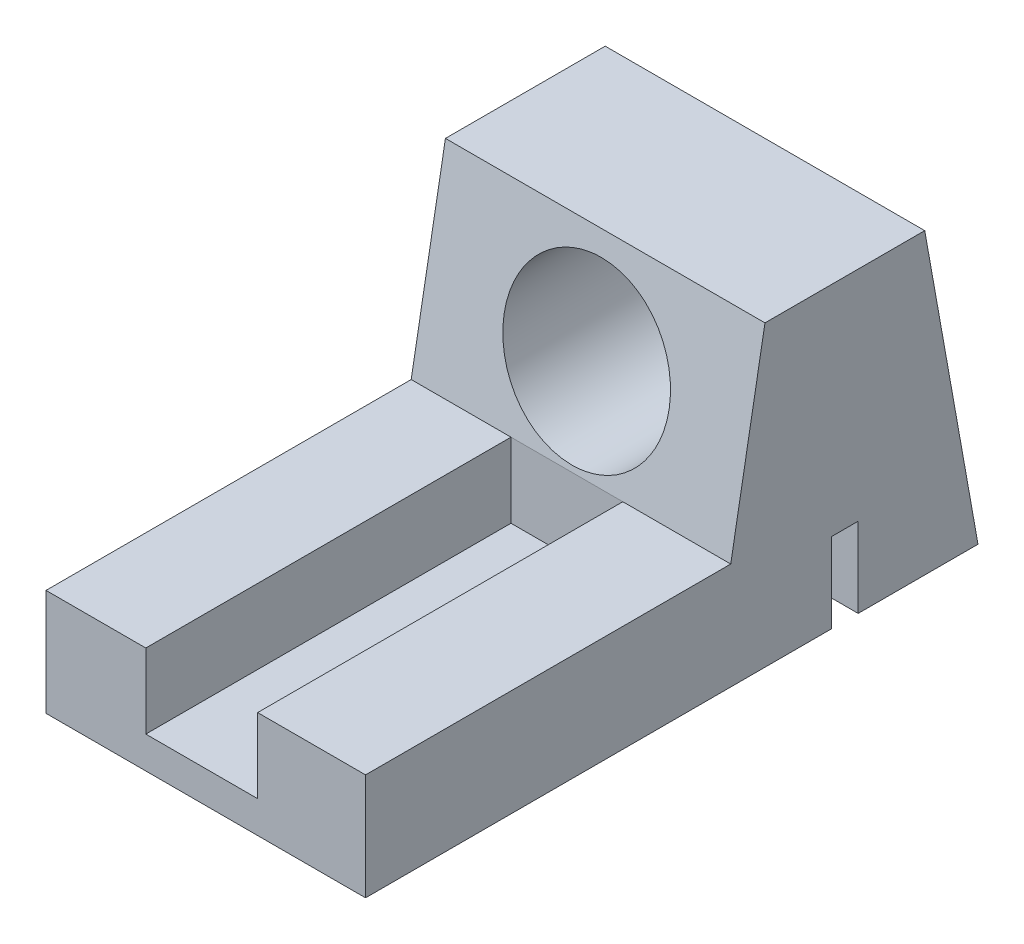
ISO-10303-21;
HEADER;
FILE_DESCRIPTION(('STEP AP214'),'2;1');
FILE_NAME('part.step','',(''),(''),'','','');
FILE_SCHEMA(('AUTOMOTIVE_DESIGN { 1 0 10303 214 1 1 1 1 }'));
ENDSEC;
DATA;
#1=APPLICATION_CONTEXT('core data for automotive mechanical design processes');
#2=APPLICATION_PROTOCOL_DEFINITION('international standard','automotive_design',2000,#1);
#3=PRODUCT_CONTEXT('',#1,'mechanical');
#4=PRODUCT('Part','Part','',(#3));
#5=PRODUCT_RELATED_PRODUCT_CATEGORY('part','',(#4));
#6=PRODUCT_DEFINITION_FORMATION('','',#4);
#7=PRODUCT_DEFINITION_CONTEXT('part definition',#1,'design');
#8=PRODUCT_DEFINITION('design','',#6,#7);
#9=PRODUCT_DEFINITION_SHAPE('','',#8);
#10=(LENGTH_UNIT() NAMED_UNIT(*) SI_UNIT(.MILLI.,.METRE.));
#11=(NAMED_UNIT(*) PLANE_ANGLE_UNIT() SI_UNIT($,.RADIAN.));
#12=(NAMED_UNIT(*) SI_UNIT($,.STERADIAN.) SOLID_ANGLE_UNIT());
#13=UNCERTAINTY_MEASURE_WITH_UNIT(LENGTH_MEASURE(1.E-05),#10,'distance_accuracy_value','');
#14=(GEOMETRIC_REPRESENTATION_CONTEXT(3) GLOBAL_UNCERTAINTY_ASSIGNED_CONTEXT((#13)) GLOBAL_UNIT_ASSIGNED_CONTEXT((#10,
#11,#12)) REPRESENTATION_CONTEXT('',''));
#15=CARTESIAN_POINT('',(0.,0.,0.));
#16=DIRECTION('',(0.,0.,1.));
#17=DIRECTION('',(1.,0.,0.));
#18=AXIS2_PLACEMENT_3D('',#15,#16,#17);
#19=CARTESIAN_POINT('',(0.,-31.454396412768,0.));
#20=DIRECTION('',(0.,-1.,0.));
#21=DIRECTION('',(0.,0.,-1.));
#22=AXIS2_PLACEMENT_3D('',#19,#20,#21);
#23=PLANE('',#22);
#24=DIRECTION('',(0.,0.,1.));
#25=VECTOR('',#24,1.);
#26=CARTESIAN_POINT('',(39.7384289344671,-31.454396412768,0.));
#27=LINE('',#26,#25);
#28=CARTESIAN_POINT('',(39.7384289344671,-31.454396412768,21.4285714285714));
#29=VERTEX_POINT('',#28);
#30=CARTESIAN_POINT('',(39.7384289344671,-31.454396412768,90.));
#31=VERTEX_POINT('',#30);
#32=EDGE_CURVE('E285',#29,#31,#27,.T.);
#33=ORIENTED_EDGE('',*,*,#32,.T.);
#34=DIRECTION('',(-1.,0.,0.));
#35=VECTOR('',#34,1.);
#36=CARTESIAN_POINT('',(60.,-31.454396412768,90.));
#37=LINE('',#36,#35);
#38=CARTESIAN_POINT('',(60.,-31.454396412768,90.));
#39=VERTEX_POINT('',#38);
#40=EDGE_CURVE('E156',#39,#31,#37,.T.);
#41=ORIENTED_EDGE('',*,*,#40,.F.);
#42=DIRECTION('',(0.,0.,1.));
#43=VECTOR('',#42,1.);
#44=CARTESIAN_POINT('',(60.,-31.454396412768,4.57508133052897));
#45=LINE('',#44,#43);
#46=CARTESIAN_POINT('',(60.,-31.454396412768,21.4285714285714));
#47=VERTEX_POINT('',#46);
#48=EDGE_CURVE('E161',#47,#39,#45,.T.);
#49=ORIENTED_EDGE('',*,*,#48,.F.);
#50=DIRECTION('',(-1.,0.,0.));
#51=VECTOR('',#50,1.);
#52=CARTESIAN_POINT('',(60.,-31.454396412768,21.4285714285714));
#53=LINE('',#52,#51);
#54=EDGE_CURVE('E11',#47,#29,#53,.T.);
#55=ORIENTED_EDGE('',*,*,#54,.T.);
#56=EDGE_LOOP('',(#33,#41,#49,#55));
#57=FACE_BOUND('',#56,.T.);
#58=ADVANCED_FACE('F33',(#57),#23,.F.);
#59=DIRECTION('',(0.,0.,-1.));
#60=VECTOR('',#59,1.);
#61=CARTESIAN_POINT('',(18.7384289344671,-31.454396412768,0.));
#62=LINE('',#61,#60);
#63=CARTESIAN_POINT('',(18.7384289344671,-31.454396412768,90.));
#64=VERTEX_POINT('',#63);
#65=CARTESIAN_POINT('',(18.7384289344671,-31.454396412768,21.4285714285714));
#66=VERTEX_POINT('',#65);
#67=EDGE_CURVE('E242',#64,#66,#62,.T.);
#68=ORIENTED_EDGE('',*,*,#67,.T.);
#69=CARTESIAN_POINT('',(0.,-31.454396412768,21.4285714285714));
#70=VERTEX_POINT('',#69);
#71=EDGE_CURVE('E41',#66,#70,#53,.T.);
#72=ORIENTED_EDGE('',*,*,#71,.T.);
#73=DIRECTION('',(0.,0.,-1.));
#74=VECTOR('',#73,1.);
#75=CARTESIAN_POINT('',(0.,-31.454396412768,4.57508133052897));
#76=LINE('',#75,#74);
#77=CARTESIAN_POINT('',(0.,-31.454396412768,90.));
#78=VERTEX_POINT('',#77);
#79=EDGE_CURVE('E170',#78,#70,#76,.T.);
#80=ORIENTED_EDGE('',*,*,#79,.F.);
#81=EDGE_CURVE('E168',#64,#78,#37,.T.);
#82=ORIENTED_EDGE('',*,*,#81,.F.);
#83=EDGE_LOOP('',(#68,#72,#80,#82));
#84=FACE_BOUND('',#83,.T.);
#85=ADVANCED_FACE('F240',(#84),#23,.F.);
#86=CARTESIAN_POINT('',(60.,-31.454396412768,90.));
#87=DIRECTION('',(0.,0.,1.));
#88=DIRECTION('',(0.,-1.,0.));
#89=AXIS2_PLACEMENT_3D('',#86,#87,#88);
#90=PLANE('',#89);
#91=ORIENTED_EDGE('',*,*,#40,.T.);
#92=DIRECTION('',(0.,1.,0.));
#93=VECTOR('',#92,1.);
#94=CARTESIAN_POINT('',(39.7384289344671,-45.454396412768,90.));
#95=LINE('',#94,#93);
#96=CARTESIAN_POINT('',(39.7384289344671,-45.454396412768,90.));
#97=VERTEX_POINT('',#96);
#98=EDGE_CURVE('E147',#97,#31,#95,.T.);
#99=ORIENTED_EDGE('',*,*,#98,.F.);
#100=DIRECTION('',(-1.,0.,0.));
#101=VECTOR('',#100,1.);
#102=CARTESIAN_POINT('',(0.,-45.454396412768,90.));
#103=LINE('',#102,#101);
#104=CARTESIAN_POINT('',(18.7384289344671,-45.454396412768,90.));
#105=VERTEX_POINT('',#104);
#106=EDGE_CURVE('E135',#97,#105,#103,.T.);
#107=ORIENTED_EDGE('',*,*,#106,.T.);
#108=DIRECTION('',(0.,1.,0.));
#109=VECTOR('',#108,1.);
#110=CARTESIAN_POINT('',(18.7384289344671,-45.454396412768,90.));
#111=LINE('',#110,#109);
#112=EDGE_CURVE('E158',#105,#64,#111,.T.);
#113=ORIENTED_EDGE('',*,*,#112,.T.);
#114=ORIENTED_EDGE('',*,*,#81,.T.);
#115=DIRECTION('',(0.,-1.,0.));
#116=VECTOR('',#115,1.);
#117=CARTESIAN_POINT('',(0.,-31.454396412768,90.));
#118=LINE('',#117,#116);
#119=CARTESIAN_POINT('',(0.,-51.454396412768,90.));
#120=VERTEX_POINT('',#119);
#121=EDGE_CURVE('E174',#78,#120,#118,.T.);
#122=ORIENTED_EDGE('',*,*,#121,.T.);
#123=DIRECTION('',(-1.,0.,0.));
#124=VECTOR('',#123,1.);
#125=CARTESIAN_POINT('',(60.,-51.454396412768,90.));
#126=LINE('',#125,#124);
#127=CARTESIAN_POINT('',(60.,-51.454396412768,90.));
#128=VERTEX_POINT('',#127);
#129=EDGE_CURVE('E157',#128,#120,#126,.T.);
#130=ORIENTED_EDGE('',*,*,#129,.F.);
#131=DIRECTION('',(0.,-1.,0.));
#132=VECTOR('',#131,1.);
#133=CARTESIAN_POINT('',(60.,-31.454396412768,90.));
#134=LINE('',#133,#132);
#135=EDGE_CURVE('E172',#39,#128,#134,.T.);
#136=ORIENTED_EDGE('',*,*,#135,.F.);
#137=EDGE_LOOP('',(#91,#99,#107,#113,#114,#122,#130,#136));
#138=FACE_BOUND('',#137,.T.);
#139=ADVANCED_FACE('F153',(#138),#90,.T.);
#140=CARTESIAN_POINT('',(60.,4.545603587232,15.));
#141=DIRECTION('',(0.,-0.175790638483658,-0.984427575508482));
#142=DIRECTION('',(0.,0.984427575508482,-0.175790638483658));
#143=AXIS2_PLACEMENT_3D('',#140,#141,#142);
#144=PLANE('',#143);
#145=CARTESIAN_POINT('',(30.,-14.954396412768,18.4821428571429));
#146=DIRECTION('',(0.,-0.175790638483658,-0.984427575508482));
#147=DIRECTION('',(0.,-0.984427575508482,0.175790638483658));
#148=AXIS2_PLACEMENT_3D('',#145,#146,#147);
#149=ELLIPSE('',#148,15.7451907947559,15.5);
#150=CARTESIAN_POINT('',(30.,-30.454396412768,21.25));
#151=VERTEX_POINT('',#150);
#152=EDGE_CURVE('E199',#151,#151,#149,.T.);
#153=ORIENTED_EDGE('',*,*,#152,.T.);
#154=EDGE_LOOP('',(#153));
#155=FACE_BOUND('',#154,.T.);
#156=ORIENTED_EDGE('',*,*,#54,.F.);
#157=DIRECTION('',(0.,-0.984427575508482,0.175790638483658));
#158=VECTOR('',#157,1.);
#159=CARTESIAN_POINT('',(60.,4.545603587232,15.));
#160=LINE('',#159,#158);
#161=CARTESIAN_POINT('',(60.,4.545603587232,15.));
#162=VERTEX_POINT('',#161);
#163=EDGE_CURVE('E203',#162,#47,#160,.T.);
#164=ORIENTED_EDGE('',*,*,#163,.F.);
#165=DIRECTION('',(-1.,0.,0.));
#166=VECTOR('',#165,1.);
#167=CARTESIAN_POINT('',(60.,4.545603587232,15.));
#168=LINE('',#167,#166);
#169=CARTESIAN_POINT('',(0.,4.545603587232,15.));
#170=VERTEX_POINT('',#169);
#171=EDGE_CURVE('E214',#162,#170,#168,.T.);
#172=ORIENTED_EDGE('',*,*,#171,.T.);
#173=DIRECTION('',(0.,-0.984427575508482,0.175790638483658));
#174=VECTOR('',#173,1.);
#175=CARTESIAN_POINT('',(0.,4.545603587232,15.));
#176=LINE('',#175,#174);
#177=EDGE_CURVE('E202',#170,#70,#176,.T.);
#178=ORIENTED_EDGE('',*,*,#177,.T.);
#179=ORIENTED_EDGE('',*,*,#71,.F.);
#180=DIRECTION('',(1.,0.,0.));
#181=VECTOR('',#180,1.);
#182=CARTESIAN_POINT('',(0.,-31.454396412768,21.4285714285714));
#183=LINE('',#182,#181);
#184=EDGE_CURVE('E150',#66,#29,#183,.T.);
#185=ORIENTED_EDGE('',*,*,#184,.T.);
#186=EDGE_LOOP('',(#156,#164,#172,#178,#179,#185));
#187=FACE_BOUND('',#186,.T.);
#188=ADVANCED_FACE('F35',(#155,#187),#144,.F.);
#189=CARTESIAN_POINT('',(60.,-51.454396412768,25.));
#190=DIRECTION('',(0.,1.,0.));
#191=DIRECTION('',(0.,0.,1.));
#192=AXIS2_PLACEMENT_3D('',#189,#190,#191);
#193=PLANE('',#192);
#194=DIRECTION('',(-1.,0.,0.));
#195=VECTOR('',#194,1.);
#196=CARTESIAN_POINT('',(60.,-51.454396412768,2.5));
#197=LINE('',#196,#195);
#198=CARTESIAN_POINT('',(60.,-51.454396412768,2.5));
#199=VERTEX_POINT('',#198);
#200=CARTESIAN_POINT('',(0.,-51.454396412768,2.5));
#201=VERTEX_POINT('',#200);
#202=EDGE_CURVE('E196',#199,#201,#197,.T.);
#203=ORIENTED_EDGE('',*,*,#202,.F.);
#204=DIRECTION('',(0.,0.,-1.));
#205=VECTOR('',#204,1.);
#206=CARTESIAN_POINT('',(60.,-51.454396412768,25.));
#207=LINE('',#206,#205);
#208=EDGE_CURVE('E208',#128,#199,#207,.T.);
#209=ORIENTED_EDGE('',*,*,#208,.F.);
#210=ORIENTED_EDGE('',*,*,#129,.T.);
#211=DIRECTION('',(0.,0.,-1.));
#212=VECTOR('',#211,1.);
#213=CARTESIAN_POINT('',(0.,-51.454396412768,25.));
#214=LINE('',#213,#212);
#215=EDGE_CURVE('E218',#120,#201,#214,.T.);
#216=ORIENTED_EDGE('',*,*,#215,.T.);
#217=EDGE_LOOP('',(#203,#209,#210,#216));
#218=FACE_BOUND('',#217,.T.);
#219=ADVANCED_FACE('F279',(#218),#193,.F.);
#220=DIRECTION('',(1.,0.,0.));
#221=VECTOR('',#220,1.);
#222=CARTESIAN_POINT('',(60.,-51.454396412768,-2.5));
#223=LINE('',#222,#221);
#224=CARTESIAN_POINT('',(0.,-51.454396412768,-2.5));
#225=VERTEX_POINT('',#224);
#226=CARTESIAN_POINT('',(60.,-51.454396412768,-2.5));
#227=VERTEX_POINT('',#226);
#228=EDGE_CURVE('E194',#225,#227,#223,.T.);
#229=ORIENTED_EDGE('',*,*,#228,.F.);
#230=CARTESIAN_POINT('',(0.,-51.454396412768,-25.));
#231=VERTEX_POINT('',#230);
#232=EDGE_CURVE('E217',#225,#231,#214,.T.);
#233=ORIENTED_EDGE('',*,*,#232,.T.);
#234=DIRECTION('',(-1.,0.,0.));
#235=VECTOR('',#234,1.);
#236=CARTESIAN_POINT('',(60.,-51.454396412768,-25.));
#237=LINE('',#236,#235);
#238=CARTESIAN_POINT('',(60.,-51.454396412768,-25.));
#239=VERTEX_POINT('',#238);
#240=EDGE_CURVE('E228',#239,#231,#237,.T.);
#241=ORIENTED_EDGE('',*,*,#240,.F.);
#242=EDGE_CURVE('E206',#227,#239,#207,.T.);
#243=ORIENTED_EDGE('',*,*,#242,.F.);
#244=EDGE_LOOP('',(#229,#233,#241,#243));
#245=FACE_BOUND('',#244,.T.);
#246=ADVANCED_FACE('F265',(#245),#193,.F.);
#247=CARTESIAN_POINT('',(60.,0.,0.));
#248=DIRECTION('',(1.,0.,0.));
#249=DIRECTION('',(0.,0.,-1.));
#250=AXIS2_PLACEMENT_3D('',#247,#248,#249);
#251=PLANE('',#250);
#252=ORIENTED_EDGE('',*,*,#208,.T.);
#253=DIRECTION('',(0.,-1.,0.));
#254=VECTOR('',#253,1.);
#255=CARTESIAN_POINT('',(60.,-66.454396412768,2.5));
#256=LINE('',#255,#254);
#257=CARTESIAN_POINT('',(60.,-36.454396412768,2.5));
#258=VERTEX_POINT('',#257);
#259=EDGE_CURVE('E179',#258,#199,#256,.T.);
#260=ORIENTED_EDGE('',*,*,#259,.F.);
#261=DIRECTION('',(0.,0.,1.));
#262=VECTOR('',#261,1.);
#263=CARTESIAN_POINT('',(60.,-36.454396412768,-2.5));
#264=LINE('',#263,#262);
#265=CARTESIAN_POINT('',(60.,-36.454396412768,-2.5));
#266=VERTEX_POINT('',#265);
#267=EDGE_CURVE('E185',#266,#258,#264,.T.);
#268=ORIENTED_EDGE('',*,*,#267,.F.);
#269=DIRECTION('',(0.,1.,0.));
#270=VECTOR('',#269,1.);
#271=CARTESIAN_POINT('',(60.,-66.454396412768,-2.5));
#272=LINE('',#271,#270);
#273=EDGE_CURVE('E182',#227,#266,#272,.T.);
#274=ORIENTED_EDGE('',*,*,#273,.F.);
#275=ORIENTED_EDGE('',*,*,#242,.T.);
#276=DIRECTION('',(0.,0.984427575508482,0.175790638483657));
#277=VECTOR('',#276,1.);
#278=CARTESIAN_POINT('',(60.,4.54560358723201,-15.));
#279=LINE('',#278,#277);
#280=CARTESIAN_POINT('',(60.,4.54560358723201,-15.));
#281=VERTEX_POINT('',#280);
#282=EDGE_CURVE('E210',#239,#281,#279,.T.);
#283=ORIENTED_EDGE('',*,*,#282,.T.);
#284=DIRECTION('',(0.,0.,1.));
#285=VECTOR('',#284,1.);
#286=CARTESIAN_POINT('',(60.,4.545603587232,15.));
#287=LINE('',#286,#285);
#288=EDGE_CURVE('E212',#281,#162,#287,.T.);
#289=ORIENTED_EDGE('',*,*,#288,.T.);
#290=ORIENTED_EDGE('',*,*,#163,.T.);
#291=ORIENTED_EDGE('',*,*,#48,.T.);
#292=ORIENTED_EDGE('',*,*,#135,.T.);
#293=EDGE_LOOP('',(#252,#260,#268,#274,#275,#283,#289,#290,#291,#292));
#294=FACE_BOUND('',#293,.T.);
#295=ADVANCED_FACE('F271',(#294),#251,.T.);
#296=CARTESIAN_POINT('',(0.,0.,0.));
#297=DIRECTION('',(1.,0.,0.));
#298=DIRECTION('',(0.,0.,-1.));
#299=AXIS2_PLACEMENT_3D('',#296,#297,#298);
#300=PLANE('',#299);
#301=DIRECTION('',(0.,-1.,0.));
#302=VECTOR('',#301,1.);
#303=CARTESIAN_POINT('',(0.,-66.454396412768,2.5));
#304=LINE('',#303,#302);
#305=CARTESIAN_POINT('',(0.,-36.454396412768,2.5));
#306=VERTEX_POINT('',#305);
#307=EDGE_CURVE('E56',#306,#201,#304,.T.);
#308=ORIENTED_EDGE('',*,*,#307,.T.);
#309=ORIENTED_EDGE('',*,*,#215,.F.);
#310=ORIENTED_EDGE('',*,*,#121,.F.);
#311=ORIENTED_EDGE('',*,*,#79,.T.);
#312=ORIENTED_EDGE('',*,*,#177,.F.);
#313=DIRECTION('',(0.,0.,1.));
#314=VECTOR('',#313,1.);
#315=CARTESIAN_POINT('',(0.,4.545603587232,15.));
#316=LINE('',#315,#314);
#317=CARTESIAN_POINT('',(0.,4.54560358723201,-15.));
#318=VERTEX_POINT('',#317);
#319=EDGE_CURVE('E207',#318,#170,#316,.T.);
#320=ORIENTED_EDGE('',*,*,#319,.F.);
#321=DIRECTION('',(0.,0.984427575508482,0.175790638483657));
#322=VECTOR('',#321,1.);
#323=CARTESIAN_POINT('',(0.,4.54560358723201,-15.));
#324=LINE('',#323,#322);
#325=EDGE_CURVE('E220',#231,#318,#324,.T.);
#326=ORIENTED_EDGE('',*,*,#325,.F.);
#327=ORIENTED_EDGE('',*,*,#232,.F.);
#328=DIRECTION('',(0.,-1.,0.));
#329=VECTOR('',#328,1.);
#330=CARTESIAN_POINT('',(0.,0.,-2.5));
#331=LINE('',#330,#329);
#332=CARTESIAN_POINT('',(0.,-36.454396412768,-2.5));
#333=VERTEX_POINT('',#332);
#334=EDGE_CURVE('E231',#333,#225,#331,.T.);
#335=ORIENTED_EDGE('',*,*,#334,.F.);
#336=DIRECTION('',(0.,0.,1.));
#337=VECTOR('',#336,1.);
#338=CARTESIAN_POINT('',(0.,-36.454396412768,-2.5));
#339=LINE('',#338,#337);
#340=EDGE_CURVE('E183',#333,#306,#339,.T.);
#341=ORIENTED_EDGE('',*,*,#340,.T.);
#342=EDGE_LOOP('',(#308,#309,#310,#311,#312,#320,#326,#327,#335,#341));
#343=FACE_BOUND('',#342,.T.);
#344=ADVANCED_FACE('F248',(#343),#300,.F.);
#345=CARTESIAN_POINT('',(60.,4.54560358723201,-15.));
#346=DIRECTION('',(0.,-0.175790638483657,0.984427575508482));
#347=DIRECTION('',(0.,-0.984427575508482,-0.175790638483657));
#348=AXIS2_PLACEMENT_3D('',#345,#346,#347);
#349=PLANE('',#348);
#350=CARTESIAN_POINT('',(30.,-14.954396412768,-18.4821428571429));
#351=DIRECTION('',(0.,-0.175790638483657,0.984427575508482));
#352=DIRECTION('',(0.,0.984427575508482,0.175790638483657));
#353=AXIS2_PLACEMENT_3D('',#350,#351,#352);
#354=ELLIPSE('',#353,15.7451907947559,15.5);
#355=CARTESIAN_POINT('',(30.,0.545603587232008,-15.7142857142857));
#356=VERTEX_POINT('',#355);
#357=EDGE_CURVE('E198',#356,#356,#354,.T.);
#358=ORIENTED_EDGE('',*,*,#357,.T.);
#359=EDGE_LOOP('',(#358));
#360=FACE_BOUND('',#359,.T.);
#361=ORIENTED_EDGE('',*,*,#325,.T.);
#362=DIRECTION('',(-1.,0.,0.));
#363=VECTOR('',#362,1.);
#364=CARTESIAN_POINT('',(60.,4.54560358723201,-15.));
#365=LINE('',#364,#363);
#366=EDGE_CURVE('E225',#281,#318,#365,.T.);
#367=ORIENTED_EDGE('',*,*,#366,.F.);
#368=ORIENTED_EDGE('',*,*,#282,.F.);
#369=ORIENTED_EDGE('',*,*,#240,.T.);
#370=EDGE_LOOP('',(#361,#367,#368,#369));
#371=FACE_BOUND('',#370,.T.);
#372=ADVANCED_FACE('F260',(#360,#371),#349,.F.);
#373=CARTESIAN_POINT('',(60.,4.545603587232,15.));
#374=DIRECTION('',(0.,-1.,0.));
#375=DIRECTION('',(0.,0.,-1.));
#376=AXIS2_PLACEMENT_3D('',#373,#374,#375);
#377=PLANE('',#376);
#378=ORIENTED_EDGE('',*,*,#319,.T.);
#379=ORIENTED_EDGE('',*,*,#171,.F.);
#380=ORIENTED_EDGE('',*,*,#288,.F.);
#381=ORIENTED_EDGE('',*,*,#366,.T.);
#382=EDGE_LOOP('',(#378,#379,#380,#381));
#383=FACE_BOUND('',#382,.T.);
#384=ADVANCED_FACE('F255',(#383),#377,.F.);
#385=CARTESIAN_POINT('',(30.,-14.954396412768,-29.));
#386=DIRECTION('',(0.,0.,1.));
#387=DIRECTION('',(1.,0.,0.));
#388=AXIS2_PLACEMENT_3D('',#385,#386,#387);
#389=CYLINDRICAL_SURFACE('',#388,15.5);
#390=ORIENTED_EDGE('',*,*,#357,.F.);
#391=EDGE_LOOP('',(#390));
#392=FACE_BOUND('',#391,.T.);
#393=ORIENTED_EDGE('',*,*,#152,.F.);
#394=EDGE_LOOP('',(#393));
#395=FACE_BOUND('',#394,.T.);
#396=ADVANCED_FACE('F312',(#392,#395),#389,.F.);
#397=CARTESIAN_POINT('',(60.,-66.454396412768,2.5));
#398=DIRECTION('',(0.,0.,-1.));
#399=DIRECTION('',(-1.,0.,0.));
#400=AXIS2_PLACEMENT_3D('',#397,#398,#399);
#401=PLANE('',#400);
#402=ORIENTED_EDGE('',*,*,#202,.T.);
#403=ORIENTED_EDGE('',*,*,#307,.F.);
#404=DIRECTION('',(-1.,0.,0.));
#405=VECTOR('',#404,1.);
#406=CARTESIAN_POINT('',(60.,-36.454396412768,2.5));
#407=LINE('',#406,#405);
#408=EDGE_CURVE('E187',#258,#306,#407,.T.);
#409=ORIENTED_EDGE('',*,*,#408,.F.);
#410=ORIENTED_EDGE('',*,*,#259,.T.);
#411=EDGE_LOOP('',(#402,#403,#409,#410));
#412=FACE_BOUND('',#411,.T.);
#413=ADVANCED_FACE('F276',(#412),#401,.T.);
#414=CARTESIAN_POINT('',(60.,-66.454396412768,-2.5));
#415=DIRECTION('',(0.,0.,1.));
#416=DIRECTION('',(1.,0.,0.));
#417=AXIS2_PLACEMENT_3D('',#414,#415,#416);
#418=PLANE('',#417);
#419=ORIENTED_EDGE('',*,*,#228,.T.);
#420=ORIENTED_EDGE('',*,*,#273,.T.);
#421=DIRECTION('',(-1.,0.,0.));
#422=VECTOR('',#421,1.);
#423=CARTESIAN_POINT('',(60.,-36.454396412768,-2.5));
#424=LINE('',#423,#422);
#425=EDGE_CURVE('E192',#266,#333,#424,.T.);
#426=ORIENTED_EDGE('',*,*,#425,.T.);
#427=ORIENTED_EDGE('',*,*,#334,.T.);
#428=EDGE_LOOP('',(#419,#420,#426,#427));
#429=FACE_BOUND('',#428,.T.);
#430=ADVANCED_FACE('F267',(#429),#418,.T.);
#431=CARTESIAN_POINT('',(60.,-36.454396412768,-2.5));
#432=DIRECTION('',(0.,-1.,0.));
#433=DIRECTION('',(0.,0.,-1.));
#434=AXIS2_PLACEMENT_3D('',#431,#432,#433);
#435=PLANE('',#434);
#436=ORIENTED_EDGE('',*,*,#340,.F.);
#437=ORIENTED_EDGE('',*,*,#425,.F.);
#438=ORIENTED_EDGE('',*,*,#267,.T.);
#439=ORIENTED_EDGE('',*,*,#408,.T.);
#440=EDGE_LOOP('',(#436,#437,#438,#439));
#441=FACE_BOUND('',#440,.T.);
#442=ADVANCED_FACE('F275',(#441),#435,.T.);
#443=CARTESIAN_POINT('',(39.7384289344671,-45.454396412768,0.));
#444=DIRECTION('',(-1.,0.,0.));
#445=DIRECTION('',(0.,0.,1.));
#446=AXIS2_PLACEMENT_3D('',#443,#444,#445);
#447=PLANE('',#446);
#448=ORIENTED_EDGE('',*,*,#32,.F.);
#449=DIRECTION('',(0.,1.,0.));
#450=VECTOR('',#449,1.);
#451=CARTESIAN_POINT('',(39.7384289344671,-45.454396412768,21.4285714285714));
#452=LINE('',#451,#450);
#453=CARTESIAN_POINT('',(39.7384289344671,-45.454396412768,21.4285714285714));
#454=VERTEX_POINT('',#453);
#455=EDGE_CURVE('E149',#454,#29,#452,.T.);
#456=ORIENTED_EDGE('',*,*,#455,.F.);
#457=DIRECTION('',(0.,0.,1.));
#458=VECTOR('',#457,1.);
#459=CARTESIAN_POINT('',(39.7384289344671,-45.454396412768,0.));
#460=LINE('',#459,#458);
#461=EDGE_CURVE('E138',#454,#97,#460,.T.);
#462=ORIENTED_EDGE('',*,*,#461,.T.);
#463=ORIENTED_EDGE('',*,*,#98,.T.);
#464=EDGE_LOOP('',(#448,#456,#462,#463));
#465=FACE_BOUND('',#464,.T.);
#466=ADVANCED_FACE('F146',(#465),#447,.T.);
#467=CARTESIAN_POINT('',(18.7384289344671,-45.454396412768,0.));
#468=DIRECTION('',(1.,0.,0.));
#469=DIRECTION('',(0.,0.,-1.));
#470=AXIS2_PLACEMENT_3D('',#467,#468,#469);
#471=PLANE('',#470);
#472=ORIENTED_EDGE('',*,*,#67,.F.);
#473=ORIENTED_EDGE('',*,*,#112,.F.);
#474=DIRECTION('',(0.,0.,-1.));
#475=VECTOR('',#474,1.);
#476=CARTESIAN_POINT('',(18.7384289344671,-45.454396412768,0.));
#477=LINE('',#476,#475);
#478=CARTESIAN_POINT('',(18.7384289344671,-45.454396412768,21.4285714285714));
#479=VERTEX_POINT('',#478);
#480=EDGE_CURVE('E48',#105,#479,#477,.T.);
#481=ORIENTED_EDGE('',*,*,#480,.T.);
#482=DIRECTION('',(0.,1.,0.));
#483=VECTOR('',#482,1.);
#484=CARTESIAN_POINT('',(18.7384289344671,-45.454396412768,21.4285714285714));
#485=LINE('',#484,#483);
#486=EDGE_CURVE('E163',#479,#66,#485,.T.);
#487=ORIENTED_EDGE('',*,*,#486,.T.);
#488=EDGE_LOOP('',(#472,#473,#481,#487));
#489=FACE_BOUND('',#488,.T.);
#490=ADVANCED_FACE('F282',(#489),#471,.T.);
#491=CARTESIAN_POINT('',(0.,-45.454396412768,21.4285714285714));
#492=DIRECTION('',(0.,0.,1.));
#493=DIRECTION('',(1.,0.,0.));
#494=AXIS2_PLACEMENT_3D('',#491,#492,#493);
#495=PLANE('',#494);
#496=ORIENTED_EDGE('',*,*,#184,.F.);
#497=ORIENTED_EDGE('',*,*,#486,.F.);
#498=DIRECTION('',(1.,0.,0.));
#499=VECTOR('',#498,1.);
#500=CARTESIAN_POINT('',(0.,-45.454396412768,21.4285714285714));
#501=LINE('',#500,#499);
#502=EDGE_CURVE('E291',#479,#454,#501,.T.);
#503=ORIENTED_EDGE('',*,*,#502,.T.);
#504=ORIENTED_EDGE('',*,*,#455,.T.);
#505=EDGE_LOOP('',(#496,#497,#503,#504));
#506=FACE_BOUND('',#505,.T.);
#507=ADVANCED_FACE('F294',(#506),#495,.T.);
#508=CARTESIAN_POINT('',(0.,-45.454396412768,0.));
#509=DIRECTION('',(0.,-1.,0.));
#510=DIRECTION('',(0.,0.,-1.));
#511=AXIS2_PLACEMENT_3D('',#508,#509,#510);
#512=PLANE('',#511);
#513=ORIENTED_EDGE('',*,*,#461,.F.);
#514=ORIENTED_EDGE('',*,*,#502,.F.);
#515=ORIENTED_EDGE('',*,*,#480,.F.);
#516=ORIENTED_EDGE('',*,*,#106,.F.);
#517=EDGE_LOOP('',(#513,#514,#515,#516));
#518=FACE_BOUND('',#517,.T.);
#519=ADVANCED_FACE('F137',(#518),#512,.F.);
#520=CLOSED_SHELL('',(#58,#85,#139,#188,#219,#246,#295,#344,#372,#384,#396,#413,#430,#442,#466,
#490,#507,#519));
#521=MANIFOLD_SOLID_BREP('B2',#520);
#522=ADVANCED_BREP_SHAPE_REPRESENTATION('',(#18,#521),#14);
#523=SHAPE_DEFINITION_REPRESENTATION(#9,#522);
ENDSEC;
END-ISO-10303-21;
